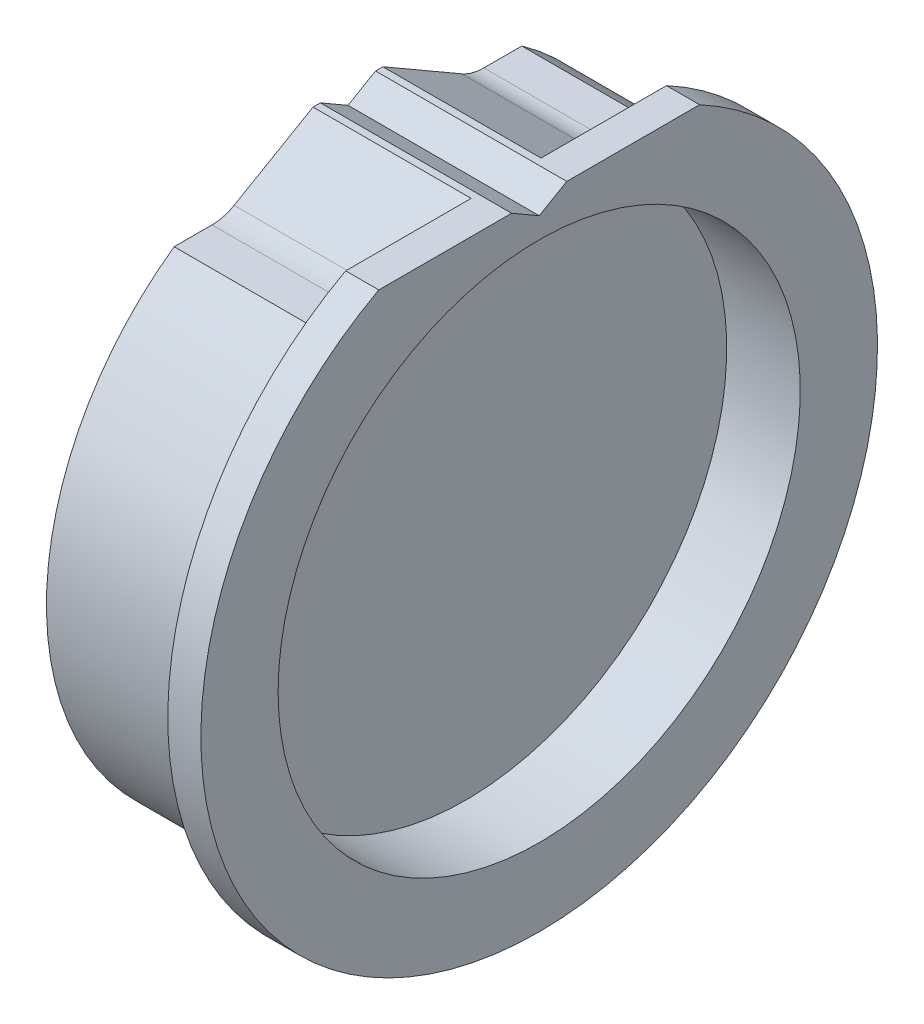
ISO-10303-21;
HEADER;
FILE_DESCRIPTION(('STEP AP214'),'2;1');
FILE_NAME('part.step','',(''),(''),'','','');
FILE_SCHEMA(('AUTOMOTIVE_DESIGN { 1 0 10303 214 1 1 1 1 }'));
ENDSEC;
DATA;
#1=APPLICATION_CONTEXT('core data for automotive mechanical design processes');
#2=APPLICATION_PROTOCOL_DEFINITION('international standard','automotive_design',2000,#1);
#3=PRODUCT_CONTEXT('',#1,'mechanical');
#4=PRODUCT('Part','Part','',(#3));
#5=PRODUCT_RELATED_PRODUCT_CATEGORY('part','',(#4));
#6=PRODUCT_DEFINITION_FORMATION('','',#4);
#7=PRODUCT_DEFINITION_CONTEXT('part definition',#1,'design');
#8=PRODUCT_DEFINITION('design','',#6,#7);
#9=PRODUCT_DEFINITION_SHAPE('','',#8);
#10=(LENGTH_UNIT() NAMED_UNIT(*) SI_UNIT(.MILLI.,.METRE.));
#11=(NAMED_UNIT(*) PLANE_ANGLE_UNIT() SI_UNIT($,.RADIAN.));
#12=(NAMED_UNIT(*) SI_UNIT($,.STERADIAN.) SOLID_ANGLE_UNIT());
#13=UNCERTAINTY_MEASURE_WITH_UNIT(LENGTH_MEASURE(1.E-05),#10,'distance_accuracy_value','');
#14=(GEOMETRIC_REPRESENTATION_CONTEXT(3) GLOBAL_UNCERTAINTY_ASSIGNED_CONTEXT((#13)) GLOBAL_UNIT_ASSIGNED_CONTEXT((#10,
#11,#12)) REPRESENTATION_CONTEXT('',''));
#15=CARTESIAN_POINT('',(0.,0.,0.));
#16=DIRECTION('',(0.,0.,1.));
#17=DIRECTION('',(1.,0.,0.));
#18=AXIS2_PLACEMENT_3D('',#15,#16,#17);
#19=CARTESIAN_POINT('',(5.5,46.,0.));
#20=DIRECTION('',(1.,0.,0.));
#21=DIRECTION('',(0.,0.,-1.));
#22=AXIS2_PLACEMENT_3D('',#19,#20,#21);
#23=PLANE('',#22);
#24=DIRECTION('',(0.,0.,1.));
#25=VECTOR('',#24,1.);
#26=CARTESIAN_POINT('',(5.5,33.5,-31.5238005322962));
#27=LINE('',#26,#25);
#28=CARTESIAN_POINT('',(5.5,33.5,-23.6378933071456));
#29=VERTEX_POINT('',#28);
#30=CARTESIAN_POINT('',(5.5,33.5,-18.4820508075689));
#31=VERTEX_POINT('',#30);
#32=EDGE_CURVE('E185',#29,#31,#27,.T.);
#33=ORIENTED_EDGE('',*,*,#32,.T.);
#34=CARTESIAN_POINT('',(5.5,39.5,-18.4820508075689));
#35=DIRECTION('',(1.,0.,0.));
#36=DIRECTION('',(0.,0.,-1.));
#37=AXIS2_PLACEMENT_3D('',#34,#35,#36);
#38=CIRCLE('',#37,6.);
#39=CARTESIAN_POINT('',(5.5,34.3038475772934,-15.4820508075689));
#40=VERTEX_POINT('',#39);
#41=EDGE_CURVE('E463',#31,#40,#38,.F.);
#42=ORIENTED_EDGE('',*,*,#41,.T.);
#43=DIRECTION('',(0.,0.5,0.866025403784439));
#44=VECTOR('',#43,1.);
#45=CARTESIAN_POINT('',(5.5,40.5,-4.75));
#46=LINE('',#45,#44);
#47=CARTESIAN_POINT('',(5.5,40.5,-4.75));
#48=VERTEX_POINT('',#47);
#49=EDGE_CURVE('E187',#40,#48,#46,.T.);
#50=ORIENTED_EDGE('',*,*,#49,.T.);
#51=DIRECTION('',(0.,0.,-1.));
#52=VECTOR('',#51,1.);
#53=CARTESIAN_POINT('',(5.5,40.5,0.));
#54=LINE('',#53,#52);
#55=CARTESIAN_POINT('',(5.5,40.5,-21.8116941111873));
#56=VERTEX_POINT('',#55);
#57=EDGE_CURVE('E236',#48,#56,#54,.T.);
#58=ORIENTED_EDGE('',*,*,#57,.T.);
#59=CARTESIAN_POINT('',(5.5,0.,0.));
#60=DIRECTION('',(-1.,0.,0.));
#61=DIRECTION('',(0.,0.,1.));
#62=AXIS2_PLACEMENT_3D('',#59,#60,#61);
#63=CIRCLE('',#62,46.);
#64=CARTESIAN_POINT('',(5.5,3.,-45.902069670114));
#65=VERTEX_POINT('',#64);
#66=EDGE_CURVE('E281',#56,#65,#63,.T.);
#67=ORIENTED_EDGE('',*,*,#66,.T.);
#68=DIRECTION('',(0.,0.,-1.));
#69=VECTOR('',#68,1.);
#70=CARTESIAN_POINT('',(5.5,3.,6.9462219947249));
#71=LINE('',#70,#69);
#72=CARTESIAN_POINT('',(5.5,3.,-42.));
#73=VERTEX_POINT('',#72);
#74=EDGE_CURVE('E180',#73,#65,#71,.T.);
#75=ORIENTED_EDGE('',*,*,#74,.F.);
#76=DIRECTION('',(0.,-1.,0.));
#77=VECTOR('',#76,1.);
#78=CARTESIAN_POINT('',(5.5,3.,-42.));
#79=LINE('',#78,#77);
#80=CARTESIAN_POINT('',(5.5,-3.,-42.));
#81=VERTEX_POINT('',#80);
#82=EDGE_CURVE('E172',#73,#81,#79,.T.);
#83=ORIENTED_EDGE('',*,*,#82,.T.);
#84=DIRECTION('',(0.,0.,-1.));
#85=VECTOR('',#84,1.);
#86=CARTESIAN_POINT('',(5.5,-3.,6.9462219947249));
#87=LINE('',#86,#85);
#88=CARTESIAN_POINT('',(5.5,-3.,-45.902069670114));
#89=VERTEX_POINT('',#88);
#90=EDGE_CURVE('E158',#81,#89,#87,.T.);
#91=ORIENTED_EDGE('',*,*,#90,.T.);
#92=CARTESIAN_POINT('',(5.5,40.5,21.8116941111873));
#93=VERTEX_POINT('',#92);
#94=EDGE_CURVE('E280',#89,#93,#63,.T.);
#95=ORIENTED_EDGE('',*,*,#94,.T.);
#96=CARTESIAN_POINT('',(5.5,40.5,4.75));
#97=VERTEX_POINT('',#96);
#98=EDGE_CURVE('E240',#93,#97,#54,.T.);
#99=ORIENTED_EDGE('',*,*,#98,.T.);
#100=DIRECTION('',(0.,-0.5,0.866025403784439));
#101=VECTOR('',#100,1.);
#102=CARTESIAN_POINT('',(5.5,40.5,4.75));
#103=LINE('',#102,#101);
#104=CARTESIAN_POINT('',(5.5,34.3038475772934,15.4820508075689));
#105=VERTEX_POINT('',#104);
#106=EDGE_CURVE('E205',#97,#105,#103,.T.);
#107=ORIENTED_EDGE('',*,*,#106,.T.);
#108=CARTESIAN_POINT('',(5.5,39.5,18.4820508075689));
#109=DIRECTION('',(1.,0.,0.));
#110=DIRECTION('',(0.,0.,-1.));
#111=AXIS2_PLACEMENT_3D('',#108,#109,#110);
#112=CIRCLE('',#111,6.);
#113=CARTESIAN_POINT('',(5.5,33.5,18.4820508075689));
#114=VERTEX_POINT('',#113);
#115=EDGE_CURVE('E461',#105,#114,#112,.F.);
#116=ORIENTED_EDGE('',*,*,#115,.T.);
#117=DIRECTION('',(0.,0.,1.));
#118=VECTOR('',#117,1.);
#119=CARTESIAN_POINT('',(5.5,33.5,31.5238005322962));
#120=LINE('',#119,#118);
#121=CARTESIAN_POINT('',(5.5,33.5,23.6378933071456));
#122=VERTEX_POINT('',#121);
#123=EDGE_CURVE('E202',#114,#122,#120,.T.);
#124=ORIENTED_EDGE('',*,*,#123,.T.);
#125=CARTESIAN_POINT('',(5.5,0.,0.));
#126=DIRECTION('',(-1.,0.,0.));
#127=DIRECTION('',(0.,0.,1.));
#128=AXIS2_PLACEMENT_3D('',#125,#126,#127);
#129=CIRCLE('',#128,41.);
#130=EDGE_CURVE('E284',#29,#122,#129,.T.);
#131=ORIENTED_EDGE('',*,*,#130,.F.);
#132=EDGE_LOOP('',(#33,#42,#50,#58,#67,#75,#83,#91,#95,#99,#107,#116,#124,#131));
#133=FACE_BOUND('',#132,.T.);
#134=ADVANCED_FACE('F16',(#133),#23,.F.);
#135=CARTESIAN_POINT('',(0.,0.,0.));
#136=DIRECTION('',(-1.,0.,0.));
#137=DIRECTION('',(0.,0.,1.));
#138=AXIS2_PLACEMENT_3D('',#135,#136,#137);
#139=CYLINDRICAL_SURFACE('',#138,46.);
#140=DIRECTION('',(-1.,0.,0.));
#141=VECTOR('',#140,1.);
#142=CARTESIAN_POINT('',(0.,3.,-45.902069670114));
#143=LINE('',#142,#141);
#144=CARTESIAN_POINT('',(6.,3.,-45.902069670114));
#145=VERTEX_POINT('',#144);
#146=EDGE_CURVE('E456',#65,#145,#143,.F.);
#147=ORIENTED_EDGE('',*,*,#146,.F.);
#148=ORIENTED_EDGE('',*,*,#66,.F.);
#149=DIRECTION('',(-1.,0.,0.));
#150=VECTOR('',#149,1.);
#151=CARTESIAN_POINT('',(19.4,40.5,-21.8116941111873));
#152=LINE('',#151,#150);
#153=CARTESIAN_POINT('',(10.,40.5,-21.8116941111873));
#154=VERTEX_POINT('',#153);
#155=EDGE_CURVE('E232',#154,#56,#152,.T.);
#156=ORIENTED_EDGE('',*,*,#155,.F.);
#157=CARTESIAN_POINT('',(10.,0.,0.));
#158=DIRECTION('',(-1.,0.,0.));
#159=DIRECTION('',(0.,0.,1.));
#160=AXIS2_PLACEMENT_3D('',#157,#158,#159);
#161=CIRCLE('',#160,46.);
#162=CARTESIAN_POINT('',(10.,40.5,21.8116941111873));
#163=VERTEX_POINT('',#162);
#164=EDGE_CURVE('E277',#154,#163,#161,.T.);
#165=ORIENTED_EDGE('',*,*,#164,.T.);
#166=DIRECTION('',(-1.,0.,0.));
#167=VECTOR('',#166,1.);
#168=CARTESIAN_POINT('',(19.4,40.5,21.8116941111873));
#169=LINE('',#168,#167);
#170=EDGE_CURVE('E233',#163,#93,#169,.T.);
#171=ORIENTED_EDGE('',*,*,#170,.T.);
#172=ORIENTED_EDGE('',*,*,#94,.F.);
#173=DIRECTION('',(-1.,0.,0.));
#174=VECTOR('',#173,1.);
#175=CARTESIAN_POINT('',(0.,-3.,-45.902069670114));
#176=LINE('',#175,#174);
#177=CARTESIAN_POINT('',(6.,-3.,-45.902069670114));
#178=VERTEX_POINT('',#177);
#179=EDGE_CURVE('E307',#178,#89,#176,.T.);
#180=ORIENTED_EDGE('',*,*,#179,.F.);
#181=CARTESIAN_POINT('',(5.5,2.95803989154981,-45.9047927780967));
#182=CARTESIAN_POINT('',(5.58304782469594,2.97208582663948,-45.9038859577529));
#183=CARTESIAN_POINT('',(5.6666882527135,2.98261794989612,-45.9032024764614));
#184=CARTESIAN_POINT('',(5.83455677463314,2.99661640564492,-45.9022916757607));
#185=CARTESIAN_POINT('',(5.91878483928982,3.00008308728703,-45.9020643338107));
#186=CARTESIAN_POINT('',(6.08717422047066,2.99991395389148,-45.9020751998683));
#187=CARTESIAN_POINT('',(6.17133553819381,2.99628363467462,-45.9023130476395));
#188=CARTESIAN_POINT('',(6.33902988282952,2.98197088790745,-45.9032449151874));
#189=CARTESIAN_POINT('',(6.42256291751513,2.97128854774962,-45.9039389293111));
#190=CARTESIAN_POINT('',(6.67141565358389,2.92873069944165,-45.9066816400448));
#191=CARTESIAN_POINT('',(6.83506174938451,2.88634422478582,-45.9093910329865));
#192=CARTESIAN_POINT('',(7.15279004406476,2.77479039939767,-45.9162674442748));
#193=CARTESIAN_POINT('',(7.30687391859765,2.70562775629948,-45.9204342063825));
#194=CARTESIAN_POINT('',(7.60141183086987,2.54240749415293,-45.9297597290347));
#195=CARTESIAN_POINT('',(7.7418535707261,2.44832769269411,-45.9349193723634));
#196=CARTESIAN_POINT('',(8.00498375721294,2.23795121929615,-45.9456487035368));
#197=CARTESIAN_POINT('',(8.12766933433351,2.12165096341902,-45.9512184574391));
#198=CARTESIAN_POINT('',(8.35200331641264,1.86990675446013,-45.9621509015156));
#199=CARTESIAN_POINT('',(8.45361558745539,1.73443057907767,-45.9675132234146));
#200=CARTESIAN_POINT('',(8.63264798757224,1.44832339278535,-45.977416365846));
#201=CARTESIAN_POINT('',(8.71006968229424,1.29769336348862,-45.9819572395355));
#202=CARTESIAN_POINT('',(8.83849919073911,0.985590119738555,-45.98970479043));
#203=CARTESIAN_POINT('',(8.8895158092117,0.824120540038975,-45.9929119123032));
#204=CARTESIAN_POINT('',(8.96370863866,0.494880431466217,-45.9976323650249));
#205=CARTESIAN_POINT('',(8.98688466742366,0.32710986136151,-45.9991456847877));
#206=CARTESIAN_POINT('',(9.00470975297855,-0.00962536868667847,-46.0003065076551));
#207=CARTESIAN_POINT('',(8.9994129835283,-0.178587150588933,-45.9999575540225));
#208=CARTESIAN_POINT('',(8.96057088158513,-0.513216526468119,-45.997441363952));
#209=CARTESIAN_POINT('',(8.92702574421209,-0.678884143190741,-45.9952741400734));
#210=CARTESIAN_POINT('',(8.83267336329643,-1.00214714651255,-45.9893666092967));
#211=CARTESIAN_POINT('',(8.77187922448946,-1.15974637285827,-45.9856270586238));
#212=CARTESIAN_POINT('',(8.6247653581854,-1.46250976419431,-45.9769945479791));
#213=CARTESIAN_POINT('',(8.53844523108928,-1.60767373446983,-45.972101569951));
#214=CARTESIAN_POINT('',(8.34255690275373,-1.88171278066504,-45.9617016903884));
#215=CARTESIAN_POINT('',(8.23294936759994,-2.01055970086312,-45.9561937577202));
#216=CARTESIAN_POINT('',(7.9936770822603,-2.2480350031958,-45.9451901882086));
#217=CARTESIAN_POINT('',(7.86401317088934,-2.35666423047358,-45.9396945508606));
#218=CARTESIAN_POINT('',(7.58813190897824,-2.55074795788927,-45.9293280067725));
#219=CARTESIAN_POINT('',(7.44189655473459,-2.63617690373463,-45.9244577919997));
#220=CARTESIAN_POINT('',(7.13706868194746,-2.78128913726058,-45.9158985973031));
#221=CARTESIAN_POINT('',(6.97847238465613,-2.84096451532589,-45.9122099803694));
#222=CARTESIAN_POINT('',(6.65359800713343,-2.9327990943883,-45.9064354777593));
#223=CARTESIAN_POINT('',(6.48732410128493,-2.96497306670933,-45.9043487317611));
#224=CARTESIAN_POINT('',(6.15185853872249,-3.00088360038289,-45.902015721621));
#225=CARTESIAN_POINT('',(5.98267175166448,-3.00466373015718,-45.901766637722));
#226=CARTESIAN_POINT('',(5.76183290104989,-2.99100112481938,-45.9026567761673));
#227=CARTESIAN_POINT('',(5.7091796996202,-2.98633962843048,-45.9029607556056));
#228=CARTESIAN_POINT('',(5.60428115083503,-2.97425296231257,-45.9037456223963));
#229=CARTESIAN_POINT('',(5.55203527206134,-2.96683238682854,-45.9042262156469));
#230=CARTESIAN_POINT('',(5.5,-2.95803989154981,-45.9047927780967));
#231=B_SPLINE_CURVE_WITH_KNOTS('',3,(#181,#182,#183,#184,#185,#186,#187,#188,#189,#190,#191,
#192,#193,#194,#195,#196,#197,#198,#199,#200,#201,#202,#203,#204,#205,#206,#207,#208,#209,#210,
#211,#212,#213,#214,#215,#216,#217,#218,#219,#220,#221,#222,#223,#224,#225,#226,#227,#228,#229,
#230),.UNSPECIFIED.,.F.,.F.,(4,2,2,2,2,2,2,2,2,2,2,2,2,2,2,2,2,2,2,2,2,2,2,2,4),(0.,
0.25261434005878,0.50521619647836,0.757622518945054,1.01002571351408,1.51461656598438,
2.01911874440999,2.52407157261974,3.02910591355021,3.53499919330756,4.04085972415974,
4.54655146740999,5.05224652031099,5.55697975367712,6.06170950072909,6.5661967704666,
7.07069193816654,7.57604610268379,8.08137913755966,8.58726654201596,9.09330920775693,
9.59907990101547,10.1040743646709,10.262602715939,10.4208682693962),.UNSPECIFIED.);
#232=EDGE_CURVE('E154',#145,#178,#231,.T.);
#233=ORIENTED_EDGE('',*,*,#232,.F.);
#234=EDGE_LOOP('',(#147,#148,#156,#165,#171,#172,#180,#233));
#235=FACE_BOUND('',#234,.T.);
#236=ADVANCED_FACE('F309',(#235),#139,.T.);
#237=CARTESIAN_POINT('',(19.4,40.5,21.8116941111873));
#238=DIRECTION('',(0.,-1.,0.));
#239=DIRECTION('',(0.,0.,-1.));
#240=AXIS2_PLACEMENT_3D('',#237,#238,#239);
#241=PLANE('',#240);
#242=DIRECTION('',(-1.,0.,0.));
#243=VECTOR('',#242,1.);
#244=CARTESIAN_POINT('',(33.1737492028671,40.5,4.75));
#245=LINE('',#244,#243);
#246=CARTESIAN_POINT('',(-16.,40.5,4.75));
#247=VERTEX_POINT('',#246);
#248=EDGE_CURVE('E200',#97,#247,#245,.T.);
#249=ORIENTED_EDGE('',*,*,#248,.F.);
#250=ORIENTED_EDGE('',*,*,#98,.F.);
#251=ORIENTED_EDGE('',*,*,#170,.F.);
#252=DIRECTION('',(0.,0.,1.));
#253=VECTOR('',#252,1.);
#254=CARTESIAN_POINT('',(10.,40.5,0.));
#255=LINE('',#254,#253);
#256=CARTESIAN_POINT('',(10.,40.5,3.75));
#257=VERTEX_POINT('',#256);
#258=EDGE_CURVE('E296',#257,#163,#255,.T.);
#259=ORIENTED_EDGE('',*,*,#258,.F.);
#260=DIRECTION('',(-1.,0.,0.));
#261=VECTOR('',#260,1.);
#262=CARTESIAN_POINT('',(10.001,40.5,3.75));
#263=LINE('',#262,#261);
#264=CARTESIAN_POINT('',(-16.,40.5,3.75));
#265=VERTEX_POINT('',#264);
#266=EDGE_CURVE('E221',#257,#265,#263,.T.);
#267=ORIENTED_EDGE('',*,*,#266,.T.);
#268=DIRECTION('',(0.,0.,1.));
#269=VECTOR('',#268,1.);
#270=CARTESIAN_POINT('',(-16.,40.5,21.8116941111873));
#271=LINE('',#270,#269);
#272=EDGE_CURVE('E224',#265,#247,#271,.T.);
#273=ORIENTED_EDGE('',*,*,#272,.T.);
#274=EDGE_LOOP('',(#249,#250,#251,#259,#267,#273));
#275=FACE_BOUND('',#274,.T.);
#276=ADVANCED_FACE('F356',(#275),#241,.F.);
#277=CARTESIAN_POINT('',(-10.,0.,0.));
#278=DIRECTION('',(1.,0.,0.));
#279=DIRECTION('',(0.,0.,-1.));
#280=AXIS2_PLACEMENT_3D('',#277,#278,#279);
#281=PLANE('',#280);
#282=CARTESIAN_POINT('',(-10.,0.,0.));
#283=DIRECTION('',(-1.,0.,0.));
#284=DIRECTION('',(0.,0.,1.));
#285=AXIS2_PLACEMENT_3D('',#282,#283,#284);
#286=CIRCLE('',#285,20.);
#287=CARTESIAN_POINT('',(-10.,0.,20.));
#288=VERTEX_POINT('',#287);
#289=EDGE_CURVE('E293',#288,#288,#286,.T.);
#290=ORIENTED_EDGE('',*,*,#289,.T.);
#291=EDGE_LOOP('',(#290));
#292=FACE_BOUND('',#291,.T.);
#293=ADVANCED_FACE('F18',(#292),#281,.F.);
#294=CARTESIAN_POINT('',(0.,0.,0.));
#295=DIRECTION('',(-1.,0.,0.));
#296=DIRECTION('',(0.,0.,1.));
#297=AXIS2_PLACEMENT_3D('',#294,#295,#296);
#298=CYLINDRICAL_SURFACE('',#297,20.);
#299=ORIENTED_EDGE('',*,*,#289,.F.);
#300=EDGE_LOOP('',(#299));
#301=FACE_BOUND('',#300,.T.);
#302=CARTESIAN_POINT('',(-16.,0.,0.));
#303=DIRECTION('',(-1.,0.,0.));
#304=DIRECTION('',(0.,0.,1.));
#305=AXIS2_PLACEMENT_3D('',#302,#303,#304);
#306=CIRCLE('',#305,20.);
#307=CARTESIAN_POINT('',(-16.,0.,20.));
#308=VERTEX_POINT('',#307);
#309=EDGE_CURVE('E290',#308,#308,#306,.T.);
#310=ORIENTED_EDGE('',*,*,#309,.T.);
#311=EDGE_LOOP('',(#310));
#312=FACE_BOUND('',#311,.T.);
#313=ADVANCED_FACE('F426',(#301,#312),#298,.F.);
#314=CARTESIAN_POINT('',(-16.,20.,0.));
#315=DIRECTION('',(1.,0.,0.));
#316=DIRECTION('',(0.,0.,-1.));
#317=AXIS2_PLACEMENT_3D('',#314,#315,#316);
#318=PLANE('',#317);
#319=CARTESIAN_POINT('',(-16.,31.5,0.));
#320=DIRECTION('',(-1.,0.,0.));
#321=DIRECTION('',(0.,0.,1.));
#322=AXIS2_PLACEMENT_3D('',#319,#320,#321);
#323=CIRCLE('',#322,3.);
#324=CARTESIAN_POINT('',(-16.,31.5,3.));
#325=VERTEX_POINT('',#324);
#326=EDGE_CURVE('E241',#325,#325,#323,.T.);
#327=ORIENTED_EDGE('',*,*,#326,.F.);
#328=EDGE_LOOP('',(#327));
#329=FACE_BOUND('',#328,.T.);
#330=CARTESIAN_POINT('',(-16.,-22.2738636073759,-22.2738636073766));
#331=DIRECTION('',(-1.,0.,0.));
#332=DIRECTION('',(0.,0.,1.));
#333=AXIS2_PLACEMENT_3D('',#330,#331,#332);
#334=CIRCLE('',#333,2.5);
#335=CARTESIAN_POINT('',(-16.,-22.2738636073759,-19.7738636073766));
#336=VERTEX_POINT('',#335);
#337=EDGE_CURVE('E250',#336,#336,#334,.T.);
#338=ORIENTED_EDGE('',*,*,#337,.F.);
#339=EDGE_LOOP('',(#338));
#340=FACE_BOUND('',#339,.T.);
#341=CARTESIAN_POINT('',(-16.,-22.2738636073765,22.273863607376));
#342=DIRECTION('',(-1.,0.,0.));
#343=DIRECTION('',(0.,0.,1.));
#344=AXIS2_PLACEMENT_3D('',#341,#342,#343);
#345=CIRCLE('',#344,2.5);
#346=CARTESIAN_POINT('',(-16.,-22.2738636073765,24.773863607376));
#347=VERTEX_POINT('',#346);
#348=EDGE_CURVE('E256',#347,#347,#345,.T.);
#349=ORIENTED_EDGE('',*,*,#348,.F.);
#350=EDGE_LOOP('',(#349));
#351=FACE_BOUND('',#350,.T.);
#352=CARTESIAN_POINT('',(-16.,22.2738636073761,22.2738636073764));
#353=DIRECTION('',(-1.,0.,0.));
#354=DIRECTION('',(0.,0.,1.));
#355=AXIS2_PLACEMENT_3D('',#352,#353,#354);
#356=CIRCLE('',#355,2.5);
#357=CARTESIAN_POINT('',(-16.,22.2738636073761,24.7738636073764));
#358=VERTEX_POINT('',#357);
#359=EDGE_CURVE('E262',#358,#358,#356,.T.);
#360=ORIENTED_EDGE('',*,*,#359,.F.);
#361=EDGE_LOOP('',(#360));
#362=FACE_BOUND('',#361,.T.);
#363=CARTESIAN_POINT('',(-16.,22.2738636073763,-22.2738636073761));
#364=DIRECTION('',(-1.,0.,0.));
#365=DIRECTION('',(0.,0.,1.));
#366=AXIS2_PLACEMENT_3D('',#363,#364,#365);
#367=CIRCLE('',#366,2.5);
#368=CARTESIAN_POINT('',(-16.,22.2738636073763,-19.7738636073761));
#369=VERTEX_POINT('',#368);
#370=EDGE_CURVE('E268',#369,#369,#367,.T.);
#371=ORIENTED_EDGE('',*,*,#370,.F.);
#372=EDGE_LOOP('',(#371));
#373=FACE_BOUND('',#372,.T.);
#374=ORIENTED_EDGE('',*,*,#309,.F.);
#375=EDGE_LOOP('',(#374));
#376=FACE_BOUND('',#375,.T.);
#377=DIRECTION('',(0.,0.5,0.866025403784439));
#378=VECTOR('',#377,1.);
#379=CARTESIAN_POINT('',(-16.,40.5,-4.75));
#380=LINE('',#379,#378);
#381=CARTESIAN_POINT('',(-16.,34.3038475772934,-15.4820508075689));
#382=VERTEX_POINT('',#381);
#383=CARTESIAN_POINT('',(-16.,40.5,-4.75));
#384=VERTEX_POINT('',#383);
#385=EDGE_CURVE('E175',#382,#384,#380,.T.);
#386=ORIENTED_EDGE('',*,*,#385,.F.);
#387=CARTESIAN_POINT('',(-16.,39.5,-18.4820508075689));
#388=DIRECTION('',(1.,0.,0.));
#389=DIRECTION('',(0.,0.,-1.));
#390=AXIS2_PLACEMENT_3D('',#387,#388,#389);
#391=CIRCLE('',#390,6.);
#392=CARTESIAN_POINT('',(-16.,33.5,-18.4820508075689));
#393=VERTEX_POINT('',#392);
#394=EDGE_CURVE('E24',#382,#393,#391,.T.);
#395=ORIENTED_EDGE('',*,*,#394,.T.);
#396=DIRECTION('',(0.,0.,1.));
#397=VECTOR('',#396,1.);
#398=CARTESIAN_POINT('',(-16.,33.5,-31.5238005322962));
#399=LINE('',#398,#397);
#400=CARTESIAN_POINT('',(-16.,33.5,-23.6378933071456));
#401=VERTEX_POINT('',#400);
#402=EDGE_CURVE('E171',#401,#393,#399,.T.);
#403=ORIENTED_EDGE('',*,*,#402,.F.);
#404=CARTESIAN_POINT('',(-16.,0.,0.));
#405=DIRECTION('',(-1.,0.,0.));
#406=DIRECTION('',(0.,0.,1.));
#407=AXIS2_PLACEMENT_3D('',#404,#405,#406);
#408=CIRCLE('',#407,41.);
#409=CARTESIAN_POINT('',(-16.,33.5,23.6378933071456));
#410=VERTEX_POINT('',#409);
#411=EDGE_CURVE('E287',#401,#410,#408,.T.);
#412=ORIENTED_EDGE('',*,*,#411,.T.);
#413=DIRECTION('',(0.,0.,1.));
#414=VECTOR('',#413,1.);
#415=CARTESIAN_POINT('',(-16.,33.5,31.5238005322962));
#416=LINE('',#415,#414);
#417=CARTESIAN_POINT('',(-16.,33.5,18.4820508075689));
#418=VERTEX_POINT('',#417);
#419=EDGE_CURVE('E198',#418,#410,#416,.T.);
#420=ORIENTED_EDGE('',*,*,#419,.F.);
#421=CARTESIAN_POINT('',(-16.,39.5,18.4820508075689));
#422=DIRECTION('',(1.,0.,0.));
#423=DIRECTION('',(0.,0.,-1.));
#424=AXIS2_PLACEMENT_3D('',#421,#422,#423);
#425=CIRCLE('',#424,6.);
#426=CARTESIAN_POINT('',(-16.,34.3038475772934,15.4820508075689));
#427=VERTEX_POINT('',#426);
#428=EDGE_CURVE('E11',#418,#427,#425,.T.);
#429=ORIENTED_EDGE('',*,*,#428,.T.);
#430=DIRECTION('',(0.,-0.5,0.866025403784439));
#431=VECTOR('',#430,1.);
#432=CARTESIAN_POINT('',(-16.,40.5,4.75));
#433=LINE('',#432,#431);
#434=EDGE_CURVE('E197',#247,#427,#433,.T.);
#435=ORIENTED_EDGE('',*,*,#434,.F.);
#436=ORIENTED_EDGE('',*,*,#272,.F.);
#437=DIRECTION('',(0.,0.5,0.866025403784436));
#438=VECTOR('',#437,1.);
#439=CARTESIAN_POINT('',(-16.,38.3349364905389,0.));
#440=LINE('',#439,#438);
#441=CARTESIAN_POINT('',(-16.,38.3349364905389,0.));
#442=VERTEX_POINT('',#441);
#443=EDGE_CURVE('E216',#442,#265,#440,.T.);
#444=ORIENTED_EDGE('',*,*,#443,.F.);
#445=DIRECTION('',(0.,-0.5,0.866025403784436));
#446=VECTOR('',#445,1.);
#447=CARTESIAN_POINT('',(-16.,40.5,-3.75));
#448=LINE('',#447,#446);
#449=CARTESIAN_POINT('',(-16.,40.5,-3.75));
#450=VERTEX_POINT('',#449);
#451=EDGE_CURVE('E218',#450,#442,#448,.T.);
#452=ORIENTED_EDGE('',*,*,#451,.F.);
#453=EDGE_CURVE('E230',#384,#450,#271,.T.);
#454=ORIENTED_EDGE('',*,*,#453,.F.);
#455=EDGE_LOOP('',(#386,#395,#403,#412,#420,#429,#435,#436,#444,#452,#454));
#456=FACE_BOUND('',#455,.T.);
#457=ADVANCED_FACE('F412',(#329,#340,#351,#362,#373,#376,#456),#318,.F.);
#458=CARTESIAN_POINT('',(0.,0.,0.));
#459=DIRECTION('',(-1.,0.,0.));
#460=DIRECTION('',(0.,0.,1.));
#461=AXIS2_PLACEMENT_3D('',#458,#459,#460);
#462=CYLINDRICAL_SURFACE('',#461,41.);
#463=ORIENTED_EDGE('',*,*,#411,.F.);
#464=DIRECTION('',(-1.,0.,0.));
#465=VECTOR('',#464,1.);
#466=CARTESIAN_POINT('',(0.,33.5,-23.6378933071456));
#467=LINE('',#466,#465);
#468=EDGE_CURVE('E194',#401,#29,#467,.F.);
#469=ORIENTED_EDGE('',*,*,#468,.T.);
#470=ORIENTED_EDGE('',*,*,#130,.T.);
#471=DIRECTION('',(-1.,0.,0.));
#472=VECTOR('',#471,1.);
#473=CARTESIAN_POINT('',(0.,33.5,23.6378933071456));
#474=LINE('',#473,#472);
#475=EDGE_CURVE('E204',#122,#410,#474,.T.);
#476=ORIENTED_EDGE('',*,*,#475,.T.);
#477=EDGE_LOOP('',(#463,#469,#470,#476));
#478=FACE_BOUND('',#477,.T.);
#479=ADVANCED_FACE('F405',(#478),#462,.T.);
#480=CARTESIAN_POINT('',(10.,46.,0.));
#481=DIRECTION('',(-1.,0.,0.));
#482=DIRECTION('',(0.,0.,1.));
#483=AXIS2_PLACEMENT_3D('',#480,#481,#482);
#484=PLANE('',#483);
#485=DIRECTION('',(0.,0.5,-0.866025403784436));
#486=VECTOR('',#485,1.);
#487=CARTESIAN_POINT('',(10.,40.5,-3.75));
#488=LINE('',#487,#486);
#489=CARTESIAN_POINT('',(10.,38.3349364905389,0.));
#490=VERTEX_POINT('',#489);
#491=CARTESIAN_POINT('',(10.,40.5,-3.75));
#492=VERTEX_POINT('',#491);
#493=EDGE_CURVE('E211',#490,#492,#488,.T.);
#494=ORIENTED_EDGE('',*,*,#493,.F.);
#495=DIRECTION('',(0.,-0.5,-0.866025403784436));
#496=VECTOR('',#495,1.);
#497=CARTESIAN_POINT('',(10.,38.3349364905389,0.));
#498=LINE('',#497,#496);
#499=EDGE_CURVE('E213',#257,#490,#498,.T.);
#500=ORIENTED_EDGE('',*,*,#499,.F.);
#501=ORIENTED_EDGE('',*,*,#258,.T.);
#502=ORIENTED_EDGE('',*,*,#164,.F.);
#503=EDGE_CURVE('E297',#154,#492,#255,.T.);
#504=ORIENTED_EDGE('',*,*,#503,.T.);
#505=EDGE_LOOP('',(#494,#500,#501,#502,#504));
#506=FACE_BOUND('',#505,.T.);
#507=CARTESIAN_POINT('',(10.,0.,0.));
#508=DIRECTION('',(-1.,0.,0.));
#509=DIRECTION('',(0.,0.,1.));
#510=AXIS2_PLACEMENT_3D('',#507,#508,#509);
#511=CIRCLE('',#510,35.5);
#512=CARTESIAN_POINT('',(10.,0.,35.5));
#513=VERTEX_POINT('',#512);
#514=EDGE_CURVE('E274',#513,#513,#511,.T.);
#515=ORIENTED_EDGE('',*,*,#514,.T.);
#516=EDGE_LOOP('',(#515));
#517=FACE_BOUND('',#516,.T.);
#518=ADVANCED_FACE('F402',(#506,#517),#484,.F.);
#519=CARTESIAN_POINT('',(0.,0.,0.));
#520=DIRECTION('',(-1.,0.,0.));
#521=DIRECTION('',(0.,0.,1.));
#522=AXIS2_PLACEMENT_3D('',#519,#520,#521);
#523=CYLINDRICAL_SURFACE('',#522,35.5);
#524=ORIENTED_EDGE('',*,*,#514,.F.);
#525=EDGE_LOOP('',(#524));
#526=FACE_BOUND('',#525,.T.);
#527=CARTESIAN_POINT('',(0.,0.,0.));
#528=DIRECTION('',(-1.,0.,0.));
#529=DIRECTION('',(0.,0.,1.));
#530=AXIS2_PLACEMENT_3D('',#527,#528,#529);
#531=CIRCLE('',#530,35.5);
#532=CARTESIAN_POINT('',(0.,0.,35.5));
#533=VERTEX_POINT('',#532);
#534=EDGE_CURVE('E271',#533,#533,#531,.T.);
#535=ORIENTED_EDGE('',*,*,#534,.T.);
#536=EDGE_LOOP('',(#535));
#537=FACE_BOUND('',#536,.T.);
#538=ADVANCED_FACE('F399',(#526,#537),#523,.F.);
#539=CARTESIAN_POINT('',(0.,35.5,0.));
#540=DIRECTION('',(-1.,0.,0.));
#541=DIRECTION('',(0.,0.,1.));
#542=AXIS2_PLACEMENT_3D('',#539,#540,#541);
#543=PLANE('',#542);
#544=ORIENTED_EDGE('',*,*,#534,.F.);
#545=EDGE_LOOP('',(#544));
#546=FACE_BOUND('',#545,.T.);
#547=ADVANCED_FACE('F395',(#546),#543,.F.);
#548=CARTESIAN_POINT('',(-16.,22.2738636073763,-22.2738636073761));
#549=DIRECTION('',(-1.,0.,0.));
#550=DIRECTION('',(0.,0.,1.));
#551=AXIS2_PLACEMENT_3D('',#548,#549,#550);
#552=CYLINDRICAL_SURFACE('',#551,2.5);
#553=CARTESIAN_POINT('',(-2.,22.2738636073763,-22.2738636073761));
#554=DIRECTION('',(-1.,0.,0.));
#555=DIRECTION('',(0.,0.,1.));
#556=AXIS2_PLACEMENT_3D('',#553,#554,#555);
#557=CIRCLE('',#556,2.5);
#558=CARTESIAN_POINT('',(-2.,22.2738636073763,-19.7738636073761));
#559=VERTEX_POINT('',#558);
#560=EDGE_CURVE('E265',#559,#559,#557,.T.);
#561=ORIENTED_EDGE('',*,*,#560,.F.);
#562=EDGE_LOOP('',(#561));
#563=FACE_BOUND('',#562,.T.);
#564=ORIENTED_EDGE('',*,*,#370,.T.);
#565=EDGE_LOOP('',(#564));
#566=FACE_BOUND('',#565,.T.);
#567=ADVANCED_FACE('F391',(#563,#566),#552,.F.);
#568=CARTESIAN_POINT('',(-2.,22.2738636073763,-22.2738636073761));
#569=DIRECTION('',(-1.,0.,0.));
#570=DIRECTION('',(0.,0.,1.));
#571=AXIS2_PLACEMENT_3D('',#568,#569,#570);
#572=CONICAL_SURFACE('',#571,2.5,1.02974425867665);
#573=CARTESIAN_POINT('',(-0.497848452431093,22.2738636073763,-22.2738636073761));
#574=VERTEX_POINT('',#573);
#575=VERTEX_LOOP('',#574);
#576=FACE_BOUND('',#575,.T.);
#577=ORIENTED_EDGE('',*,*,#560,.T.);
#578=EDGE_LOOP('',(#577));
#579=FACE_BOUND('',#578,.T.);
#580=ADVANCED_FACE('F387',(#576,#579),#572,.F.);
#581=CARTESIAN_POINT('',(-16.,22.2738636073761,22.2738636073764));
#582=DIRECTION('',(-1.,0.,0.));
#583=DIRECTION('',(0.,0.,1.));
#584=AXIS2_PLACEMENT_3D('',#581,#582,#583);
#585=CYLINDRICAL_SURFACE('',#584,2.5);
#586=CARTESIAN_POINT('',(-2.,22.2738636073761,22.2738636073764));
#587=DIRECTION('',(-1.,0.,0.));
#588=DIRECTION('',(0.,0.,1.));
#589=AXIS2_PLACEMENT_3D('',#586,#587,#588);
#590=CIRCLE('',#589,2.5);
#591=CARTESIAN_POINT('',(-2.,22.2738636073761,24.7738636073764));
#592=VERTEX_POINT('',#591);
#593=EDGE_CURVE('E259',#592,#592,#590,.T.);
#594=ORIENTED_EDGE('',*,*,#593,.F.);
#595=EDGE_LOOP('',(#594));
#596=FACE_BOUND('',#595,.T.);
#597=ORIENTED_EDGE('',*,*,#359,.T.);
#598=EDGE_LOOP('',(#597));
#599=FACE_BOUND('',#598,.T.);
#600=ADVANCED_FACE('F383',(#596,#599),#585,.F.);
#601=CARTESIAN_POINT('',(-2.,22.2738636073761,22.2738636073764));
#602=DIRECTION('',(-1.,0.,0.));
#603=DIRECTION('',(0.,0.,1.));
#604=AXIS2_PLACEMENT_3D('',#601,#602,#603);
#605=CONICAL_SURFACE('',#604,2.5,1.02974425867665);
#606=CARTESIAN_POINT('',(-0.497848452431093,22.2738636073761,22.2738636073764));
#607=VERTEX_POINT('',#606);
#608=VERTEX_LOOP('',#607);
#609=FACE_BOUND('',#608,.T.);
#610=ORIENTED_EDGE('',*,*,#593,.T.);
#611=EDGE_LOOP('',(#610));
#612=FACE_BOUND('',#611,.T.);
#613=ADVANCED_FACE('F379',(#609,#612),#605,.F.);
#614=CARTESIAN_POINT('',(-16.,-22.2738636073765,22.273863607376));
#615=DIRECTION('',(-1.,0.,0.));
#616=DIRECTION('',(0.,0.,1.));
#617=AXIS2_PLACEMENT_3D('',#614,#615,#616);
#618=CYLINDRICAL_SURFACE('',#617,2.5);
#619=CARTESIAN_POINT('',(-2.,-22.2738636073765,22.273863607376));
#620=DIRECTION('',(-1.,0.,0.));
#621=DIRECTION('',(0.,0.,1.));
#622=AXIS2_PLACEMENT_3D('',#619,#620,#621);
#623=CIRCLE('',#622,2.5);
#624=CARTESIAN_POINT('',(-2.,-22.2738636073765,24.773863607376));
#625=VERTEX_POINT('',#624);
#626=EDGE_CURVE('E253',#625,#625,#623,.T.);
#627=ORIENTED_EDGE('',*,*,#626,.F.);
#628=EDGE_LOOP('',(#627));
#629=FACE_BOUND('',#628,.T.);
#630=ORIENTED_EDGE('',*,*,#348,.T.);
#631=EDGE_LOOP('',(#630));
#632=FACE_BOUND('',#631,.T.);
#633=ADVANCED_FACE('F375',(#629,#632),#618,.F.);
#634=CARTESIAN_POINT('',(-2.,-22.2738636073765,22.273863607376));
#635=DIRECTION('',(-1.,0.,0.));
#636=DIRECTION('',(0.,0.,1.));
#637=AXIS2_PLACEMENT_3D('',#634,#635,#636);
#638=CONICAL_SURFACE('',#637,2.5,1.02974425867665);
#639=CARTESIAN_POINT('',(-0.497848452431093,-22.2738636073765,22.273863607376));
#640=VERTEX_POINT('',#639);
#641=VERTEX_LOOP('',#640);
#642=FACE_BOUND('',#641,.T.);
#643=ORIENTED_EDGE('',*,*,#626,.T.);
#644=EDGE_LOOP('',(#643));
#645=FACE_BOUND('',#644,.T.);
#646=ADVANCED_FACE('F371',(#642,#645),#638,.F.);
#647=CARTESIAN_POINT('',(-16.,-22.2738636073759,-22.2738636073766));
#648=DIRECTION('',(-1.,0.,0.));
#649=DIRECTION('',(0.,0.,1.));
#650=AXIS2_PLACEMENT_3D('',#647,#648,#649);
#651=CYLINDRICAL_SURFACE('',#650,2.5);
#652=CARTESIAN_POINT('',(-2.,-22.2738636073759,-22.2738636073766));
#653=DIRECTION('',(-1.,0.,0.));
#654=DIRECTION('',(0.,0.,1.));
#655=AXIS2_PLACEMENT_3D('',#652,#653,#654);
#656=CIRCLE('',#655,2.5);
#657=CARTESIAN_POINT('',(-2.,-22.2738636073759,-19.7738636073766));
#658=VERTEX_POINT('',#657);
#659=EDGE_CURVE('E247',#658,#658,#656,.T.);
#660=ORIENTED_EDGE('',*,*,#659,.F.);
#661=EDGE_LOOP('',(#660));
#662=FACE_BOUND('',#661,.T.);
#663=ORIENTED_EDGE('',*,*,#337,.T.);
#664=EDGE_LOOP('',(#663));
#665=FACE_BOUND('',#664,.T.);
#666=ADVANCED_FACE('F367',(#662,#665),#651,.F.);
#667=CARTESIAN_POINT('',(-2.,-22.2738636073759,-22.2738636073766));
#668=DIRECTION('',(-1.,0.,0.));
#669=DIRECTION('',(0.,0.,1.));
#670=AXIS2_PLACEMENT_3D('',#667,#668,#669);
#671=CONICAL_SURFACE('',#670,2.5,1.02974425867665);
#672=CARTESIAN_POINT('',(-0.497848452431093,-22.2738636073759,-22.2738636073766));
#673=VERTEX_POINT('',#672);
#674=VERTEX_LOOP('',#673);
#675=FACE_BOUND('',#674,.T.);
#676=ORIENTED_EDGE('',*,*,#659,.T.);
#677=EDGE_LOOP('',(#676));
#678=FACE_BOUND('',#677,.T.);
#679=ADVANCED_FACE('F363',(#675,#678),#671,.F.);
#680=CARTESIAN_POINT('',(-6.,31.5,0.));
#681=DIRECTION('',(-1.,0.,0.));
#682=DIRECTION('',(0.,0.,1.));
#683=AXIS2_PLACEMENT_3D('',#680,#681,#682);
#684=CONICAL_SURFACE('',#683,3.,1.0471975511966);
#685=CARTESIAN_POINT('',(-4.26794919243113,31.5,0.));
#686=VERTEX_POINT('',#685);
#687=VERTEX_LOOP('',#686);
#688=FACE_BOUND('',#687,.T.);
#689=CARTESIAN_POINT('',(-6.,31.5,0.));
#690=DIRECTION('',(-1.,0.,0.));
#691=DIRECTION('',(0.,0.,1.));
#692=AXIS2_PLACEMENT_3D('',#689,#690,#691);
#693=CIRCLE('',#692,3.);
#694=CARTESIAN_POINT('',(-6.,31.5,3.));
#695=VERTEX_POINT('',#694);
#696=EDGE_CURVE('E244',#695,#695,#693,.T.);
#697=ORIENTED_EDGE('',*,*,#696,.T.);
#698=EDGE_LOOP('',(#697));
#699=FACE_BOUND('',#698,.T.);
#700=ADVANCED_FACE('F359',(#688,#699),#684,.F.);
#701=CARTESIAN_POINT('',(-16.,31.5,0.));
#702=DIRECTION('',(-1.,0.,0.));
#703=DIRECTION('',(0.,0.,1.));
#704=AXIS2_PLACEMENT_3D('',#701,#702,#703);
#705=CYLINDRICAL_SURFACE('',#704,3.);
#706=ORIENTED_EDGE('',*,*,#696,.F.);
#707=EDGE_LOOP('',(#706));
#708=FACE_BOUND('',#707,.T.);
#709=ORIENTED_EDGE('',*,*,#326,.T.);
#710=EDGE_LOOP('',(#709));
#711=FACE_BOUND('',#710,.T.);
#712=ADVANCED_FACE('F354',(#708,#711),#705,.F.);
#713=ORIENTED_EDGE('',*,*,#57,.F.);
#714=DIRECTION('',(-1.,0.,0.));
#715=VECTOR('',#714,1.);
#716=CARTESIAN_POINT('',(33.1737492028671,40.5,-4.75));
#717=LINE('',#716,#715);
#718=EDGE_CURVE('E189',#48,#384,#717,.T.);
#719=ORIENTED_EDGE('',*,*,#718,.T.);
#720=ORIENTED_EDGE('',*,*,#453,.T.);
#721=DIRECTION('',(-1.,0.,0.));
#722=VECTOR('',#721,1.);
#723=CARTESIAN_POINT('',(10.001,40.5,-3.75));
#724=LINE('',#723,#722);
#725=EDGE_CURVE('E225',#492,#450,#724,.T.);
#726=ORIENTED_EDGE('',*,*,#725,.F.);
#727=ORIENTED_EDGE('',*,*,#503,.F.);
#728=ORIENTED_EDGE('',*,*,#155,.T.);
#729=EDGE_LOOP('',(#713,#719,#720,#726,#727,#728));
#730=FACE_BOUND('',#729,.T.);
#731=ADVANCED_FACE('F350',(#730),#241,.F.);
#732=CARTESIAN_POINT('',(10.001,38.3349364905389,0.));
#733=DIRECTION('',(0.,-0.866025403784436,0.5));
#734=DIRECTION('',(0.,-0.5,-0.866025403784436));
#735=AXIS2_PLACEMENT_3D('',#732,#733,#734);
#736=PLANE('',#735);
#737=ORIENTED_EDGE('',*,*,#499,.T.);
#738=DIRECTION('',(-1.,0.,0.));
#739=VECTOR('',#738,1.);
#740=CARTESIAN_POINT('',(10.001,38.3349364905389,0.));
#741=LINE('',#740,#739);
#742=EDGE_CURVE('E222',#490,#442,#741,.T.);
#743=ORIENTED_EDGE('',*,*,#742,.T.);
#744=ORIENTED_EDGE('',*,*,#443,.T.);
#745=ORIENTED_EDGE('',*,*,#266,.F.);
#746=EDGE_LOOP('',(#737,#743,#744,#745));
#747=FACE_BOUND('',#746,.T.);
#748=ADVANCED_FACE('F346',(#747),#736,.F.);
#749=CARTESIAN_POINT('',(10.001,40.5,-3.75));
#750=DIRECTION('',(0.,-0.866025403784436,-0.5));
#751=DIRECTION('',(0.,0.5,-0.866025403784436));
#752=AXIS2_PLACEMENT_3D('',#749,#750,#751);
#753=PLANE('',#752);
#754=ORIENTED_EDGE('',*,*,#493,.T.);
#755=ORIENTED_EDGE('',*,*,#725,.T.);
#756=ORIENTED_EDGE('',*,*,#451,.T.);
#757=ORIENTED_EDGE('',*,*,#742,.F.);
#758=EDGE_LOOP('',(#754,#755,#756,#757));
#759=FACE_BOUND('',#758,.T.);
#760=ADVANCED_FACE('F339',(#759),#753,.F.);
#761=CARTESIAN_POINT('',(33.1737492028671,33.5,31.5238005322962));
#762=DIRECTION('',(0.,-1.,0.));
#763=DIRECTION('',(0.,0.,-1.));
#764=AXIS2_PLACEMENT_3D('',#761,#762,#763);
#765=PLANE('',#764);
#766=ORIENTED_EDGE('',*,*,#123,.F.);
#767=DIRECTION('',(-1.,0.,0.));
#768=VECTOR('',#767,1.);
#769=CARTESIAN_POINT('',(-16.,33.5,18.4820508075689));
#770=LINE('',#769,#768);
#771=EDGE_CURVE('E465',#114,#418,#770,.T.);
#772=ORIENTED_EDGE('',*,*,#771,.T.);
#773=ORIENTED_EDGE('',*,*,#419,.T.);
#774=ORIENTED_EDGE('',*,*,#475,.F.);
#775=EDGE_LOOP('',(#766,#772,#773,#774));
#776=FACE_BOUND('',#775,.T.);
#777=ADVANCED_FACE('F336',(#776),#765,.F.);
#778=CARTESIAN_POINT('',(33.1737492028671,40.5,4.75));
#779=DIRECTION('',(0.,-0.866025403784439,-0.5));
#780=DIRECTION('',(0.,0.5,-0.866025403784439));
#781=AXIS2_PLACEMENT_3D('',#778,#779,#780);
#782=PLANE('',#781);
#783=ORIENTED_EDGE('',*,*,#434,.T.);
#784=DIRECTION('',(-1.,0.,0.));
#785=VECTOR('',#784,1.);
#786=CARTESIAN_POINT('',(5.5,34.3038475772934,15.4820508075689));
#787=LINE('',#786,#785);
#788=EDGE_CURVE('E467',#427,#105,#787,.F.);
#789=ORIENTED_EDGE('',*,*,#788,.T.);
#790=ORIENTED_EDGE('',*,*,#106,.F.);
#791=ORIENTED_EDGE('',*,*,#248,.T.);
#792=EDGE_LOOP('',(#783,#789,#790,#791));
#793=FACE_BOUND('',#792,.T.);
#794=ADVANCED_FACE('F334',(#793),#782,.F.);
#795=CARTESIAN_POINT('',(33.1737492028671,33.5,-31.5238005322962));
#796=DIRECTION('',(0.,-1.,0.));
#797=DIRECTION('',(0.,0.,-1.));
#798=AXIS2_PLACEMENT_3D('',#795,#796,#797);
#799=PLANE('',#798);
#800=ORIENTED_EDGE('',*,*,#402,.T.);
#801=DIRECTION('',(-1.,0.,0.));
#802=VECTOR('',#801,1.);
#803=CARTESIAN_POINT('',(5.5,33.5,-18.4820508075689));
#804=LINE('',#803,#802);
#805=EDGE_CURVE('E457',#393,#31,#804,.F.);
#806=ORIENTED_EDGE('',*,*,#805,.T.);
#807=ORIENTED_EDGE('',*,*,#32,.F.);
#808=ORIENTED_EDGE('',*,*,#468,.F.);
#809=EDGE_LOOP('',(#800,#806,#807,#808));
#810=FACE_BOUND('',#809,.T.);
#811=ADVANCED_FACE('F330',(#810),#799,.F.);
#812=CARTESIAN_POINT('',(33.1737492028671,40.5,-4.75));
#813=DIRECTION('',(0.,-0.866025403784439,0.5));
#814=DIRECTION('',(0.,-0.5,-0.866025403784439));
#815=AXIS2_PLACEMENT_3D('',#812,#813,#814);
#816=PLANE('',#815);
#817=ORIENTED_EDGE('',*,*,#49,.F.);
#818=DIRECTION('',(-1.,0.,0.));
#819=VECTOR('',#818,1.);
#820=CARTESIAN_POINT('',(-16.,34.3038475772934,-15.4820508075689));
#821=LINE('',#820,#819);
#822=EDGE_CURVE('E447',#40,#382,#821,.T.);
#823=ORIENTED_EDGE('',*,*,#822,.T.);
#824=ORIENTED_EDGE('',*,*,#385,.T.);
#825=ORIENTED_EDGE('',*,*,#718,.F.);
#826=EDGE_LOOP('',(#817,#823,#824,#825));
#827=FACE_BOUND('',#826,.T.);
#828=ADVANCED_FACE('F324',(#827),#816,.F.);
#829=CARTESIAN_POINT('',(5.5,3.,6.9462219947249));
#830=DIRECTION('',(0.,-1.,0.));
#831=DIRECTION('',(0.,0.,-1.));
#832=AXIS2_PLACEMENT_3D('',#829,#830,#831);
#833=PLANE('',#832);
#834=ORIENTED_EDGE('',*,*,#146,.T.);
#835=DIRECTION('',(0.,0.,-1.));
#836=VECTOR('',#835,1.);
#837=CARTESIAN_POINT('',(6.,3.,6.9462219947249));
#838=LINE('',#837,#836);
#839=CARTESIAN_POINT('',(6.,3.,-42.));
#840=VERTEX_POINT('',#839);
#841=EDGE_CURVE('E182',#840,#145,#838,.T.);
#842=ORIENTED_EDGE('',*,*,#841,.F.);
#843=DIRECTION('',(-1.,0.,0.));
#844=VECTOR('',#843,1.);
#845=CARTESIAN_POINT('',(5.5,3.,-42.));
#846=LINE('',#845,#844);
#847=EDGE_CURVE('E166',#840,#73,#846,.T.);
#848=ORIENTED_EDGE('',*,*,#847,.T.);
#849=ORIENTED_EDGE('',*,*,#74,.T.);
#850=EDGE_LOOP('',(#834,#842,#848,#849));
#851=FACE_BOUND('',#850,.T.);
#852=ADVANCED_FACE('F321',(#851),#833,.T.);
#853=CARTESIAN_POINT('',(5.5,-3.,6.9462219947249));
#854=DIRECTION('',(0.,1.,0.));
#855=DIRECTION('',(-1.,0.,0.));
#856=AXIS2_PLACEMENT_3D('',#853,#854,#855);
#857=PLANE('',#856);
#858=ORIENTED_EDGE('',*,*,#179,.T.);
#859=ORIENTED_EDGE('',*,*,#90,.F.);
#860=DIRECTION('',(1.,0.,0.));
#861=VECTOR('',#860,1.);
#862=CARTESIAN_POINT('',(5.5,-3.,-42.));
#863=LINE('',#862,#861);
#864=CARTESIAN_POINT('',(6.,-3.,-42.));
#865=VERTEX_POINT('',#864);
#866=EDGE_CURVE('E163',#81,#865,#863,.T.);
#867=ORIENTED_EDGE('',*,*,#866,.T.);
#868=DIRECTION('',(0.,0.,-1.));
#869=VECTOR('',#868,1.);
#870=CARTESIAN_POINT('',(6.,-3.,6.9462219947249));
#871=LINE('',#870,#869);
#872=EDGE_CURVE('E149',#865,#178,#871,.T.);
#873=ORIENTED_EDGE('',*,*,#872,.T.);
#874=EDGE_LOOP('',(#858,#859,#867,#873));
#875=FACE_BOUND('',#874,.T.);
#876=ADVANCED_FACE('F168',(#875),#857,.T.);
#877=CARTESIAN_POINT('',(6.,0.,6.9462219947249));
#878=DIRECTION('',(0.,0.,-1.));
#879=DIRECTION('',(-1.,0.,0.));
#880=AXIS2_PLACEMENT_3D('',#877,#878,#879);
#881=CYLINDRICAL_SURFACE('',#880,3.);
#882=ORIENTED_EDGE('',*,*,#232,.T.);
#883=ORIENTED_EDGE('',*,*,#872,.F.);
#884=CARTESIAN_POINT('',(6.,0.,-42.));
#885=DIRECTION('',(0.,0.,1.));
#886=DIRECTION('',(1.,0.,0.));
#887=AXIS2_PLACEMENT_3D('',#884,#885,#886);
#888=CIRCLE('',#887,3.);
#889=EDGE_CURVE('E152',#865,#840,#888,.T.);
#890=ORIENTED_EDGE('',*,*,#889,.T.);
#891=ORIENTED_EDGE('',*,*,#841,.T.);
#892=EDGE_LOOP('',(#882,#883,#890,#891));
#893=FACE_BOUND('',#892,.T.);
#894=ADVANCED_FACE('F151',(#893),#881,.F.);
#895=CARTESIAN_POINT('',(0.,0.,-42.));
#896=DIRECTION('',(0.,0.,1.));
#897=DIRECTION('',(1.,0.,0.));
#898=AXIS2_PLACEMENT_3D('',#895,#896,#897);
#899=PLANE('',#898);
#900=ORIENTED_EDGE('',*,*,#889,.F.);
#901=ORIENTED_EDGE('',*,*,#866,.F.);
#902=ORIENTED_EDGE('',*,*,#82,.F.);
#903=ORIENTED_EDGE('',*,*,#847,.F.);
#904=EDGE_LOOP('',(#900,#901,#902,#903));
#905=FACE_BOUND('',#904,.T.);
#906=ADVANCED_FACE('F162',(#905),#899,.F.);
#907=CARTESIAN_POINT('',(33.1737492028671,39.5,-18.4820508075689));
#908=DIRECTION('',(1.,0.,0.));
#909=DIRECTION('',(0.,0.,-1.));
#910=AXIS2_PLACEMENT_3D('',#907,#908,#909);
#911=CYLINDRICAL_SURFACE('',#910,6.);
#912=ORIENTED_EDGE('',*,*,#41,.F.);
#913=ORIENTED_EDGE('',*,*,#805,.F.);
#914=ORIENTED_EDGE('',*,*,#394,.F.);
#915=ORIENTED_EDGE('',*,*,#822,.F.);
#916=EDGE_LOOP('',(#912,#913,#914,#915));
#917=FACE_BOUND('',#916,.T.);
#918=ADVANCED_FACE('F317',(#917),#911,.F.);
#919=CARTESIAN_POINT('',(33.1737492028671,39.5,18.4820508075689));
#920=DIRECTION('',(1.,0.,0.));
#921=DIRECTION('',(0.,0.,-1.));
#922=AXIS2_PLACEMENT_3D('',#919,#920,#921);
#923=CYLINDRICAL_SURFACE('',#922,6.);
#924=ORIENTED_EDGE('',*,*,#115,.F.);
#925=ORIENTED_EDGE('',*,*,#788,.F.);
#926=ORIENTED_EDGE('',*,*,#428,.F.);
#927=ORIENTED_EDGE('',*,*,#771,.F.);
#928=EDGE_LOOP('',(#924,#925,#926,#927));
#929=FACE_BOUND('',#928,.T.);
#930=ADVANCED_FACE('F473',(#929),#923,.F.);
#931=CLOSED_SHELL('',(#134,#236,#276,#293,#313,#457,#479,#518,#538,#547,#567,#580,#600,#613,
#633,#646,#666,#679,#700,#712,#731,#748,#760,#777,#794,#811,#828,#852,#876,#894,#906,#918,#930));
#932=MANIFOLD_SOLID_BREP('B1',#931);
#933=ADVANCED_BREP_SHAPE_REPRESENTATION('',(#18,#932),#14);
#934=SHAPE_DEFINITION_REPRESENTATION(#9,#933);
ENDSEC;
END-ISO-10303-21;
